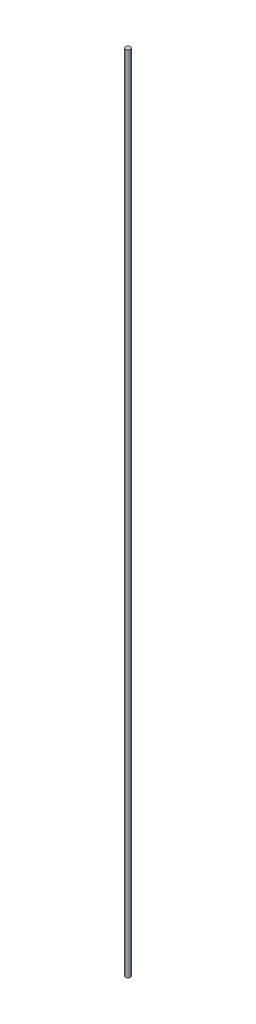
ISO-10303-21;
HEADER;
FILE_DESCRIPTION(('STEP AP214'),'2;1');
FILE_NAME('part.step','',(''),(''),'','','');
FILE_SCHEMA(('AUTOMOTIVE_DESIGN { 1 0 10303 214 1 1 1 1 }'));
ENDSEC;
DATA;
#1=APPLICATION_CONTEXT('core data for automotive mechanical design processes');
#2=APPLICATION_PROTOCOL_DEFINITION('international standard','automotive_design',2000,#1);
#3=PRODUCT_CONTEXT('',#1,'mechanical');
#4=PRODUCT('Part','Part','',(#3));
#5=PRODUCT_RELATED_PRODUCT_CATEGORY('part','',(#4));
#6=PRODUCT_DEFINITION_FORMATION('','',#4);
#7=PRODUCT_DEFINITION_CONTEXT('part definition',#1,'design');
#8=PRODUCT_DEFINITION('design','',#6,#7);
#9=PRODUCT_DEFINITION_SHAPE('','',#8);
#10=(LENGTH_UNIT() NAMED_UNIT(*) SI_UNIT(.MILLI.,.METRE.));
#11=(NAMED_UNIT(*) PLANE_ANGLE_UNIT() SI_UNIT($,.RADIAN.));
#12=(NAMED_UNIT(*) SI_UNIT($,.STERADIAN.) SOLID_ANGLE_UNIT());
#13=UNCERTAINTY_MEASURE_WITH_UNIT(LENGTH_MEASURE(1.E-05),#10,'distance_accuracy_value','');
#14=(GEOMETRIC_REPRESENTATION_CONTEXT(3) GLOBAL_UNCERTAINTY_ASSIGNED_CONTEXT((#13)) GLOBAL_UNIT_ASSIGNED_CONTEXT((#10,
#11,#12)) REPRESENTATION_CONTEXT('',''));
#15=CARTESIAN_POINT('',(0.,0.,0.));
#16=DIRECTION('',(0.,0.,1.));
#17=DIRECTION('',(1.,0.,0.));
#18=AXIS2_PLACEMENT_3D('',#15,#16,#17);
#19=CARTESIAN_POINT('',(0.,-47.8811269837221,0.));
#20=DIRECTION('',(0.,1.,0.));
#21=DIRECTION('',(0.,0.,1.));
#22=AXIS2_PLACEMENT_3D('',#19,#20,#21);
#23=CYLINDRICAL_SURFACE('',#22,0.109999999999999);
#24=CARTESIAN_POINT('',(0.,-37.57,0.));
#25=DIRECTION('',(0.,1.,0.));
#26=DIRECTION('',(-1.,0.,0.));
#27=AXIS2_PLACEMENT_3D('',#24,#25,#26);
#28=CIRCLE('',#27,0.109999999999999);
#29=CARTESIAN_POINT('',(-0.109999999999999,-37.57,0.));
#30=VERTEX_POINT('',#29);
#31=EDGE_CURVE('E10',#30,#30,#28,.F.);
#32=ORIENTED_EDGE('',*,*,#31,.F.);
#33=EDGE_LOOP('',(#32));
#34=FACE_BOUND('',#33,.T.);
#35=CARTESIAN_POINT('',(0.,0.,0.));
#36=DIRECTION('',(0.,1.,0.));
#37=DIRECTION('',(0.,0.,1.));
#38=AXIS2_PLACEMENT_3D('',#35,#36,#37);
#39=CIRCLE('',#38,0.109999999999999);
#40=CARTESIAN_POINT('',(0.,0.,0.109999999999999));
#41=VERTEX_POINT('',#40);
#42=EDGE_CURVE('E39',#41,#41,#39,.T.);
#43=ORIENTED_EDGE('',*,*,#42,.F.);
#44=EDGE_LOOP('',(#43));
#45=FACE_BOUND('',#44,.T.);
#46=ADVANCED_FACE('F33',(#34,#45),#23,.T.);
#47=CARTESIAN_POINT('',(0.,0.,0.));
#48=DIRECTION('',(0.,1.,0.));
#49=DIRECTION('',(0.,0.,1.));
#50=AXIS2_PLACEMENT_3D('',#47,#48,#49);
#51=PLANE('',#50);
#52=ORIENTED_EDGE('',*,*,#42,.T.);
#53=EDGE_LOOP('',(#52));
#54=FACE_BOUND('',#53,.T.);
#55=ADVANCED_FACE('F45',(#54),#51,.T.);
#56=CARTESIAN_POINT('',(0.,-37.57,0.));
#57=DIRECTION('',(0.,1.,0.));
#58=DIRECTION('',(0.961490609092656,0.,0.274837786024107));
#59=AXIS2_PLACEMENT_3D('',#56,#57,#58);
#60=PLANE('',#59);
#61=ORIENTED_EDGE('',*,*,#31,.T.);
#62=EDGE_LOOP('',(#61));
#63=FACE_BOUND('',#62,.T.);
#64=ADVANCED_FACE('F52',(#63),#60,.F.);
#65=CLOSED_SHELL('',(#46,#55,#64));
#66=MANIFOLD_SOLID_BREP('B2',#65);
#67=ADVANCED_BREP_SHAPE_REPRESENTATION('',(#18,#66),#14);
#68=SHAPE_DEFINITION_REPRESENTATION(#9,#67);
ENDSEC;
END-ISO-10303-21;
